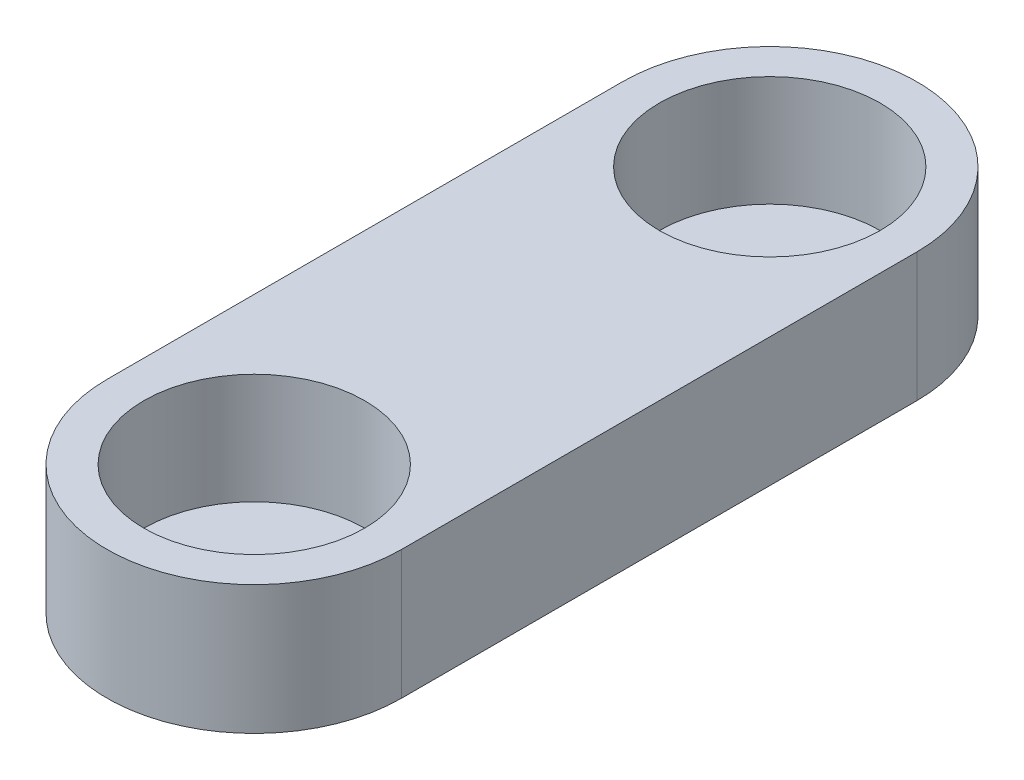
ISO-10303-21;
HEADER;
FILE_DESCRIPTION(('STEP AP214'),'2;1');
FILE_NAME('part.step','',(''),(''),'','','');
FILE_SCHEMA(('AUTOMOTIVE_DESIGN { 1 0 10303 214 1 1 1 1 }'));
ENDSEC;
DATA;
#1=APPLICATION_CONTEXT('core data for automotive mechanical design processes');
#2=APPLICATION_PROTOCOL_DEFINITION('international standard','automotive_design',2000,#1);
#3=PRODUCT_CONTEXT('',#1,'mechanical');
#4=PRODUCT('Part','Part','',(#3));
#5=PRODUCT_RELATED_PRODUCT_CATEGORY('part','',(#4));
#6=PRODUCT_DEFINITION_FORMATION('','',#4);
#7=PRODUCT_DEFINITION_CONTEXT('part definition',#1,'design');
#8=PRODUCT_DEFINITION('design','',#6,#7);
#9=PRODUCT_DEFINITION_SHAPE('','',#8);
#10=(LENGTH_UNIT() NAMED_UNIT(*) SI_UNIT(.MILLI.,.METRE.));
#11=(NAMED_UNIT(*) PLANE_ANGLE_UNIT() SI_UNIT($,.RADIAN.));
#12=(NAMED_UNIT(*) SI_UNIT($,.STERADIAN.) SOLID_ANGLE_UNIT());
#13=UNCERTAINTY_MEASURE_WITH_UNIT(LENGTH_MEASURE(1.E-05),#10,'distance_accuracy_value','');
#14=(GEOMETRIC_REPRESENTATION_CONTEXT(3) GLOBAL_UNCERTAINTY_ASSIGNED_CONTEXT((#13)) GLOBAL_UNIT_ASSIGNED_CONTEXT((#10,
#11,#12)) REPRESENTATION_CONTEXT('',''));
#15=CARTESIAN_POINT('',(0.,0.,0.));
#16=DIRECTION('',(0.,0.,1.));
#17=DIRECTION('',(1.,0.,0.));
#18=AXIS2_PLACEMENT_3D('',#15,#16,#17);
#19=CARTESIAN_POINT('',(0.,3.,-7.));
#20=DIRECTION('',(0.,1.,0.));
#21=DIRECTION('',(0.,0.,1.));
#22=AXIS2_PLACEMENT_3D('',#19,#20,#21);
#23=PLANE('',#22);
#24=CARTESIAN_POINT('',(0.,3.,-7.));
#25=DIRECTION('',(0.,1.,0.));
#26=DIRECTION('',(0.,0.,1.));
#27=AXIS2_PLACEMENT_3D('',#24,#25,#26);
#28=CIRCLE('',#27,3.);
#29=CARTESIAN_POINT('',(0.,3.,-4.));
#30=VERTEX_POINT('',#29);
#31=EDGE_CURVE('E129',#30,#30,#28,.T.);
#32=ORIENTED_EDGE('',*,*,#31,.F.);
#33=EDGE_LOOP('',(#32));
#34=FACE_BOUND('',#33,.T.);
#35=CARTESIAN_POINT('',(0.,3.,-7.));
#36=DIRECTION('',(0.,1.,0.));
#37=DIRECTION('',(0.,0.,1.));
#38=AXIS2_PLACEMENT_3D('',#35,#36,#37);
#39=CIRCLE('',#38,4.);
#40=CARTESIAN_POINT('',(4.,3.,-7.));
#41=VERTEX_POINT('',#40);
#42=CARTESIAN_POINT('',(-4.,3.,-7.));
#43=VERTEX_POINT('',#42);
#44=EDGE_CURVE('E133',#41,#43,#39,.T.);
#45=ORIENTED_EDGE('',*,*,#44,.T.);
#46=DIRECTION('',(0.,0.,1.));
#47=VECTOR('',#46,1.);
#48=CARTESIAN_POINT('',(-4.,3.,-7.));
#49=LINE('',#48,#47);
#50=CARTESIAN_POINT('',(-4.,3.,7.));
#51=VERTEX_POINT('',#50);
#52=EDGE_CURVE('E139',#43,#51,#49,.T.);
#53=ORIENTED_EDGE('',*,*,#52,.T.);
#54=CARTESIAN_POINT('',(0.,3.,7.));
#55=DIRECTION('',(0.,1.,0.));
#56=DIRECTION('',(0.,0.,1.));
#57=AXIS2_PLACEMENT_3D('',#54,#55,#56);
#58=CIRCLE('',#57,4.);
#59=CARTESIAN_POINT('',(4.,3.,7.));
#60=VERTEX_POINT('',#59);
#61=EDGE_CURVE('E66',#51,#60,#58,.T.);
#62=ORIENTED_EDGE('',*,*,#61,.T.);
#63=DIRECTION('',(0.,0.,-1.));
#64=VECTOR('',#63,1.);
#65=CARTESIAN_POINT('',(4.,3.,-7.));
#66=LINE('',#65,#64);
#67=EDGE_CURVE('E61',#60,#41,#66,.T.);
#68=ORIENTED_EDGE('',*,*,#67,.T.);
#69=EDGE_LOOP('',(#45,#53,#62,#68));
#70=FACE_BOUND('',#69,.T.);
#71=CARTESIAN_POINT('',(0.,3.,7.));
#72=DIRECTION('',(0.,1.,0.));
#73=DIRECTION('',(0.,0.,1.));
#74=AXIS2_PLACEMENT_3D('',#71,#72,#73);
#75=CIRCLE('',#74,3.);
#76=CARTESIAN_POINT('',(0.,3.,10.));
#77=VERTEX_POINT('',#76);
#78=EDGE_CURVE('E121',#77,#77,#75,.T.);
#79=ORIENTED_EDGE('',*,*,#78,.F.);
#80=EDGE_LOOP('',(#79));
#81=FACE_BOUND('',#80,.T.);
#82=ADVANCED_FACE('F45',(#34,#70,#81),#23,.T.);
#83=CARTESIAN_POINT('',(0.,3.,-7.));
#84=DIRECTION('',(0.,-1.,0.));
#85=DIRECTION('',(0.,0.,-1.));
#86=AXIS2_PLACEMENT_3D('',#83,#84,#85);
#87=CYLINDRICAL_SURFACE('',#86,4.);
#88=DIRECTION('',(0.,-1.,0.));
#89=VECTOR('',#88,1.);
#90=CARTESIAN_POINT('',(4.,3.,-7.));
#91=LINE('',#90,#89);
#92=CARTESIAN_POINT('',(4.,-0.5,-7.));
#93=VERTEX_POINT('',#92);
#94=EDGE_CURVE('E146',#41,#93,#91,.T.);
#95=ORIENTED_EDGE('',*,*,#94,.T.);
#96=CARTESIAN_POINT('',(0.,-0.5,-7.));
#97=DIRECTION('',(0.,-1.,0.));
#98=DIRECTION('',(0.,0.,-1.));
#99=AXIS2_PLACEMENT_3D('',#96,#97,#98);
#100=CIRCLE('',#99,4.);
#101=CARTESIAN_POINT('',(-4.,-0.5,-7.));
#102=VERTEX_POINT('',#101);
#103=EDGE_CURVE('E101',#102,#93,#100,.T.);
#104=ORIENTED_EDGE('',*,*,#103,.F.);
#105=DIRECTION('',(0.,-1.,0.));
#106=VECTOR('',#105,1.);
#107=CARTESIAN_POINT('',(-4.,3.,-7.));
#108=LINE('',#107,#106);
#109=EDGE_CURVE('E11',#43,#102,#108,.T.);
#110=ORIENTED_EDGE('',*,*,#109,.F.);
#111=ORIENTED_EDGE('',*,*,#44,.F.);
#112=EDGE_LOOP('',(#95,#104,#110,#111));
#113=FACE_BOUND('',#112,.T.);
#114=ADVANCED_FACE('F47',(#113),#87,.T.);
#115=CARTESIAN_POINT('',(-4.,3.,-7.));
#116=DIRECTION('',(1.,0.,0.));
#117=DIRECTION('',(0.,0.,-1.));
#118=AXIS2_PLACEMENT_3D('',#115,#116,#117);
#119=PLANE('',#118);
#120=ORIENTED_EDGE('',*,*,#109,.T.);
#121=DIRECTION('',(0.,0.,-1.));
#122=VECTOR('',#121,1.);
#123=CARTESIAN_POINT('',(-4.,-0.5,7.));
#124=LINE('',#123,#122);
#125=CARTESIAN_POINT('',(-4.,-0.5,7.));
#126=VERTEX_POINT('',#125);
#127=EDGE_CURVE('E94',#126,#102,#124,.T.);
#128=ORIENTED_EDGE('',*,*,#127,.F.);
#129=DIRECTION('',(0.,-1.,0.));
#130=VECTOR('',#129,1.);
#131=CARTESIAN_POINT('',(-4.,3.,7.));
#132=LINE('',#131,#130);
#133=EDGE_CURVE('E54',#51,#126,#132,.T.);
#134=ORIENTED_EDGE('',*,*,#133,.F.);
#135=ORIENTED_EDGE('',*,*,#52,.F.);
#136=EDGE_LOOP('',(#120,#128,#134,#135));
#137=FACE_BOUND('',#136,.T.);
#138=ADVANCED_FACE('F95',(#137),#119,.F.);
#139=CARTESIAN_POINT('',(0.,3.,7.));
#140=DIRECTION('',(0.,-1.,0.));
#141=DIRECTION('',(0.,0.,-1.));
#142=AXIS2_PLACEMENT_3D('',#139,#140,#141);
#143=CYLINDRICAL_SURFACE('',#142,4.);
#144=ORIENTED_EDGE('',*,*,#133,.T.);
#145=CARTESIAN_POINT('',(0.,-0.5,7.));
#146=DIRECTION('',(0.,-1.,0.));
#147=DIRECTION('',(0.,0.,-1.));
#148=AXIS2_PLACEMENT_3D('',#145,#146,#147);
#149=CIRCLE('',#148,4.);
#150=CARTESIAN_POINT('',(4.,-0.5,7.));
#151=VERTEX_POINT('',#150);
#152=EDGE_CURVE('E89',#151,#126,#149,.T.);
#153=ORIENTED_EDGE('',*,*,#152,.F.);
#154=DIRECTION('',(0.,-1.,0.));
#155=VECTOR('',#154,1.);
#156=CARTESIAN_POINT('',(4.,3.,7.));
#157=LINE('',#156,#155);
#158=EDGE_CURVE('E92',#60,#151,#157,.T.);
#159=ORIENTED_EDGE('',*,*,#158,.F.);
#160=ORIENTED_EDGE('',*,*,#61,.F.);
#161=EDGE_LOOP('',(#144,#153,#159,#160));
#162=FACE_BOUND('',#161,.T.);
#163=ADVANCED_FACE('F87',(#162),#143,.T.);
#164=CARTESIAN_POINT('',(4.,3.,-7.));
#165=DIRECTION('',(-1.,0.,0.));
#166=DIRECTION('',(0.,0.,1.));
#167=AXIS2_PLACEMENT_3D('',#164,#165,#166);
#168=PLANE('',#167);
#169=ORIENTED_EDGE('',*,*,#158,.T.);
#170=DIRECTION('',(0.,0.,1.));
#171=VECTOR('',#170,1.);
#172=CARTESIAN_POINT('',(4.,-0.5,7.));
#173=LINE('',#172,#171);
#174=EDGE_CURVE('E106',#93,#151,#173,.T.);
#175=ORIENTED_EDGE('',*,*,#174,.F.);
#176=ORIENTED_EDGE('',*,*,#94,.F.);
#177=ORIENTED_EDGE('',*,*,#67,.F.);
#178=EDGE_LOOP('',(#169,#175,#176,#177));
#179=FACE_BOUND('',#178,.T.);
#180=ADVANCED_FACE('F151',(#179),#168,.F.);
#181=CARTESIAN_POINT('',(0.,3.,-7.));
#182=DIRECTION('',(0.,-1.,0.));
#183=DIRECTION('',(0.,0.,-1.));
#184=AXIS2_PLACEMENT_3D('',#181,#182,#183);
#185=CYLINDRICAL_SURFACE('',#184,3.);
#186=ORIENTED_EDGE('',*,*,#31,.T.);
#187=EDGE_LOOP('',(#186));
#188=FACE_BOUND('',#187,.T.);
#189=CARTESIAN_POINT('',(0.,0.,-7.));
#190=DIRECTION('',(0.,1.,0.));
#191=DIRECTION('',(0.,0.,1.));
#192=AXIS2_PLACEMENT_3D('',#189,#190,#191);
#193=CIRCLE('',#192,3.);
#194=CARTESIAN_POINT('',(0.,0.,-4.));
#195=VERTEX_POINT('',#194);
#196=EDGE_CURVE('E125',#195,#195,#193,.T.);
#197=ORIENTED_EDGE('',*,*,#196,.F.);
#198=EDGE_LOOP('',(#197));
#199=FACE_BOUND('',#198,.T.);
#200=ADVANCED_FACE('F164',(#188,#199),#185,.F.);
#201=CARTESIAN_POINT('',(0.,3.,7.));
#202=DIRECTION('',(0.,-1.,0.));
#203=DIRECTION('',(0.,0.,-1.));
#204=AXIS2_PLACEMENT_3D('',#201,#202,#203);
#205=CYLINDRICAL_SURFACE('',#204,3.);
#206=ORIENTED_EDGE('',*,*,#78,.T.);
#207=EDGE_LOOP('',(#206));
#208=FACE_BOUND('',#207,.T.);
#209=CARTESIAN_POINT('',(0.,0.,7.));
#210=DIRECTION('',(0.,1.,0.));
#211=DIRECTION('',(0.,0.,1.));
#212=AXIS2_PLACEMENT_3D('',#209,#210,#211);
#213=CIRCLE('',#212,3.);
#214=CARTESIAN_POINT('',(0.,0.,10.));
#215=VERTEX_POINT('',#214);
#216=EDGE_CURVE('E120',#215,#215,#213,.T.);
#217=ORIENTED_EDGE('',*,*,#216,.F.);
#218=EDGE_LOOP('',(#217));
#219=FACE_BOUND('',#218,.T.);
#220=ADVANCED_FACE('F160',(#208,#219),#205,.F.);
#221=CARTESIAN_POINT('',(0.,0.,7.));
#222=DIRECTION('',(0.,-1.,0.));
#223=DIRECTION('',(0.,0.,-1.));
#224=AXIS2_PLACEMENT_3D('',#221,#222,#223);
#225=PLANE('',#224);
#226=ORIENTED_EDGE('',*,*,#216,.T.);
#227=EDGE_LOOP('',(#226));
#228=FACE_BOUND('',#227,.T.);
#229=ADVANCED_FACE('F163',(#228),#225,.F.);
#230=ORIENTED_EDGE('',*,*,#196,.T.);
#231=EDGE_LOOP('',(#230));
#232=FACE_BOUND('',#231,.T.);
#233=ADVANCED_FACE('F169',(#232),#225,.F.);
#234=CARTESIAN_POINT('',(0.,-0.5,7.));
#235=DIRECTION('',(0.,-1.,0.));
#236=DIRECTION('',(0.,0.,-1.));
#237=AXIS2_PLACEMENT_3D('',#234,#235,#236);
#238=PLANE('',#237);
#239=CARTESIAN_POINT('',(0.,-0.5,0.));
#240=DIRECTION('',(0.,-1.,0.));
#241=DIRECTION('',(0.,0.,-1.));
#242=AXIS2_PLACEMENT_3D('',#239,#240,#241);
#243=CIRCLE('',#242,0.75);
#244=CARTESIAN_POINT('',(0.,-0.5,-0.75));
#245=VERTEX_POINT('',#244);
#246=EDGE_CURVE('E112',#245,#245,#243,.T.);
#247=ORIENTED_EDGE('',*,*,#246,.F.);
#248=EDGE_LOOP('',(#247));
#249=FACE_BOUND('',#248,.T.);
#250=ORIENTED_EDGE('',*,*,#152,.T.);
#251=ORIENTED_EDGE('',*,*,#127,.T.);
#252=ORIENTED_EDGE('',*,*,#103,.T.);
#253=ORIENTED_EDGE('',*,*,#174,.T.);
#254=EDGE_LOOP('',(#250,#251,#252,#253));
#255=FACE_BOUND('',#254,.T.);
#256=ADVANCED_FACE('F104',(#249,#255),#238,.T.);
#257=CARTESIAN_POINT('',(0.,2.,0.));
#258=DIRECTION('',(0.,-1.,0.));
#259=DIRECTION('',(0.,0.,-1.));
#260=AXIS2_PLACEMENT_3D('',#257,#258,#259);
#261=CYLINDRICAL_SURFACE('',#260,0.75);
#262=CARTESIAN_POINT('',(0.,2.,0.));
#263=DIRECTION('',(0.,-1.,0.));
#264=DIRECTION('',(0.,0.,-1.));
#265=AXIS2_PLACEMENT_3D('',#262,#263,#264);
#266=CIRCLE('',#265,0.75);
#267=CARTESIAN_POINT('',(0.,2.,-0.75));
#268=VERTEX_POINT('',#267);
#269=EDGE_CURVE('E108',#268,#268,#266,.T.);
#270=ORIENTED_EDGE('',*,*,#269,.F.);
#271=EDGE_LOOP('',(#270));
#272=FACE_BOUND('',#271,.T.);
#273=ORIENTED_EDGE('',*,*,#246,.T.);
#274=EDGE_LOOP('',(#273));
#275=FACE_BOUND('',#274,.T.);
#276=ADVANCED_FACE('F253',(#272,#275),#261,.F.);
#277=CARTESIAN_POINT('',(0.,2.,0.));
#278=DIRECTION('',(0.,-1.,0.));
#279=DIRECTION('',(0.,0.,-1.));
#280=AXIS2_PLACEMENT_3D('',#277,#278,#279);
#281=PLANE('',#280);
#282=ORIENTED_EDGE('',*,*,#269,.T.);
#283=EDGE_LOOP('',(#282));
#284=FACE_BOUND('',#283,.T.);
#285=ADVANCED_FACE('F262',(#284),#281,.T.);
#286=CLOSED_SHELL('',(#82,#114,#138,#163,#180,#200,#220,#229,#233,#256,#276,#285));
#287=MANIFOLD_SOLID_BREP('B2',#286);
#288=ADVANCED_BREP_SHAPE_REPRESENTATION('',(#18,#287),#14);
#289=SHAPE_DEFINITION_REPRESENTATION(#9,#288);
ENDSEC;
END-ISO-10303-21;
